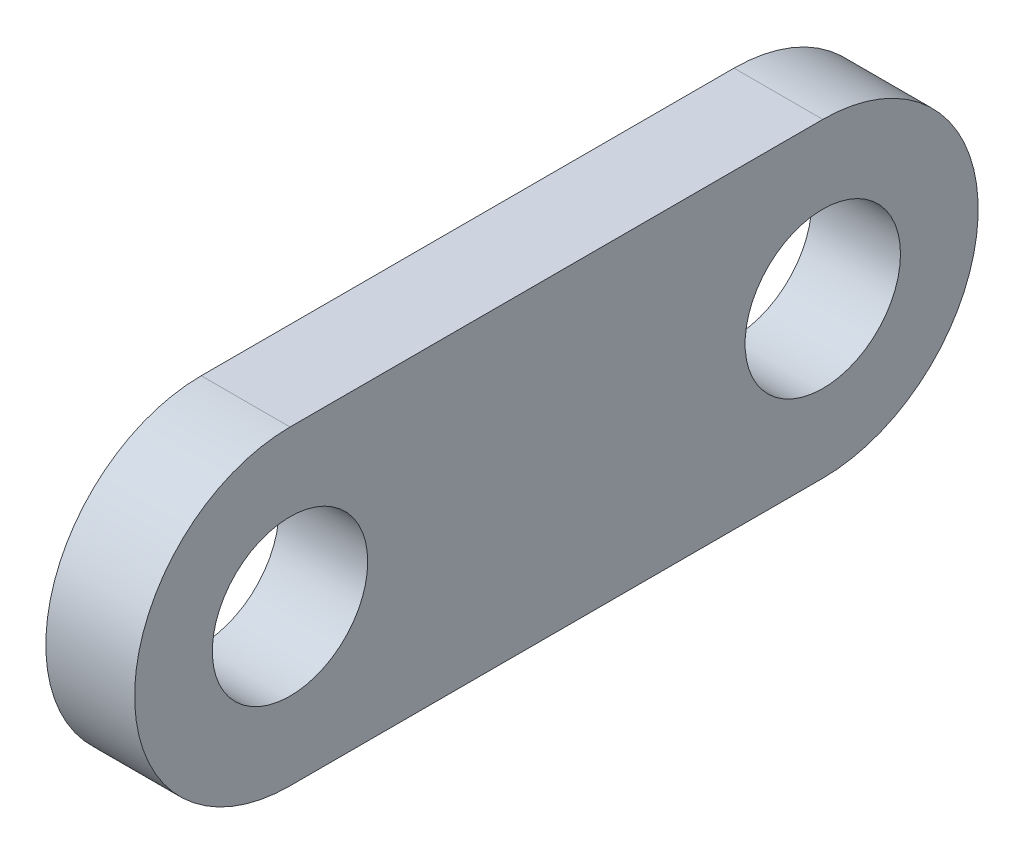
ISO-10303-21;
HEADER;
FILE_DESCRIPTION(('STEP AP214'),'2;1');
FILE_NAME('part.step','',(''),(''),'','','');
FILE_SCHEMA(('AUTOMOTIVE_DESIGN { 1 0 10303 214 1 1 1 1 }'));
ENDSEC;
DATA;
#1=APPLICATION_CONTEXT('core data for automotive mechanical design processes');
#2=APPLICATION_PROTOCOL_DEFINITION('international standard','automotive_design',2000,#1);
#3=PRODUCT_CONTEXT('',#1,'mechanical');
#4=PRODUCT('Part','Part','',(#3));
#5=PRODUCT_RELATED_PRODUCT_CATEGORY('part','',(#4));
#6=PRODUCT_DEFINITION_FORMATION('','',#4);
#7=PRODUCT_DEFINITION_CONTEXT('part definition',#1,'design');
#8=PRODUCT_DEFINITION('design','',#6,#7);
#9=PRODUCT_DEFINITION_SHAPE('','',#8);
#10=(LENGTH_UNIT() NAMED_UNIT(*) SI_UNIT(.MILLI.,.METRE.));
#11=(NAMED_UNIT(*) PLANE_ANGLE_UNIT() SI_UNIT($,.RADIAN.));
#12=(NAMED_UNIT(*) SI_UNIT($,.STERADIAN.) SOLID_ANGLE_UNIT());
#13=UNCERTAINTY_MEASURE_WITH_UNIT(LENGTH_MEASURE(1.E-05),#10,'distance_accuracy_value','');
#14=(GEOMETRIC_REPRESENTATION_CONTEXT(3) GLOBAL_UNCERTAINTY_ASSIGNED_CONTEXT((#13)) GLOBAL_UNIT_ASSIGNED_CONTEXT((#10,
#11,#12)) REPRESENTATION_CONTEXT('',''));
#15=CARTESIAN_POINT('',(0.,0.,0.));
#16=DIRECTION('',(0.,0.,1.));
#17=DIRECTION('',(1.,0.,0.));
#18=AXIS2_PLACEMENT_3D('',#15,#16,#17);
#19=CARTESIAN_POINT('',(2.,0.77334506111397,6.));
#20=DIRECTION('',(-1.,0.,0.));
#21=DIRECTION('',(0.,0.,1.));
#22=AXIS2_PLACEMENT_3D('',#19,#20,#21);
#23=PLANE('',#22);
#24=CARTESIAN_POINT('',(2.,0.77334506111397,6.));
#25=DIRECTION('',(1.,0.,0.));
#26=DIRECTION('',(0.,0.,-1.));
#27=AXIS2_PLACEMENT_3D('',#24,#25,#26);
#28=CIRCLE('',#27,1.75);
#29=CARTESIAN_POINT('',(2.,0.77334506111397,4.25));
#30=VERTEX_POINT('',#29);
#31=EDGE_CURVE('E102',#30,#30,#28,.T.);
#32=ORIENTED_EDGE('',*,*,#31,.F.);
#33=EDGE_LOOP('',(#32));
#34=FACE_BOUND('',#33,.T.);
#35=CARTESIAN_POINT('',(2.,0.77334506111397,6.));
#36=DIRECTION('',(1.,0.,0.));
#37=DIRECTION('',(0.,0.,1.));
#38=AXIS2_PLACEMENT_3D('',#35,#36,#37);
#39=CIRCLE('',#38,3.5);
#40=CARTESIAN_POINT('',(2.,4.27334506111397,6.));
#41=VERTEX_POINT('',#40);
#42=CARTESIAN_POINT('',(2.,-2.72665493888603,6.));
#43=VERTEX_POINT('',#42);
#44=EDGE_CURVE('E87',#41,#43,#39,.T.);
#45=ORIENTED_EDGE('',*,*,#44,.T.);
#46=DIRECTION('',(0.,0.,-1.));
#47=VECTOR('',#46,1.);
#48=CARTESIAN_POINT('',(2.,-2.72665493888603,6.));
#49=LINE('',#48,#47);
#50=CARTESIAN_POINT('',(2.,-2.72665493888603,-6.));
#51=VERTEX_POINT('',#50);
#52=EDGE_CURVE('E82',#43,#51,#49,.T.);
#53=ORIENTED_EDGE('',*,*,#52,.T.);
#54=CARTESIAN_POINT('',(2.,0.77334506111397,-6.));
#55=DIRECTION('',(1.,0.,0.));
#56=DIRECTION('',(0.,0.,1.));
#57=AXIS2_PLACEMENT_3D('',#54,#55,#56);
#58=CIRCLE('',#57,3.5);
#59=CARTESIAN_POINT('',(2.,4.27334506111397,-6.));
#60=VERTEX_POINT('',#59);
#61=EDGE_CURVE('E85',#51,#60,#58,.T.);
#62=ORIENTED_EDGE('',*,*,#61,.T.);
#63=DIRECTION('',(0.,0.,1.));
#64=VECTOR('',#63,1.);
#65=CARTESIAN_POINT('',(2.,4.27334506111397,6.));
#66=LINE('',#65,#64);
#67=EDGE_CURVE('E52',#60,#41,#66,.T.);
#68=ORIENTED_EDGE('',*,*,#67,.T.);
#69=EDGE_LOOP('',(#45,#53,#62,#68));
#70=FACE_BOUND('',#69,.T.);
#71=CARTESIAN_POINT('',(2.,0.77334506111397,-6.));
#72=DIRECTION('',(1.,0.,0.));
#73=DIRECTION('',(0.,0.,-1.));
#74=AXIS2_PLACEMENT_3D('',#71,#72,#73);
#75=CIRCLE('',#74,1.75);
#76=CARTESIAN_POINT('',(2.,0.77334506111397,-7.75));
#77=VERTEX_POINT('',#76);
#78=EDGE_CURVE('E117',#77,#77,#75,.T.);
#79=ORIENTED_EDGE('',*,*,#78,.F.);
#80=EDGE_LOOP('',(#79));
#81=FACE_BOUND('',#80,.T.);
#82=ADVANCED_FACE('F35',(#34,#70,#81),#23,.F.);
#83=CARTESIAN_POINT('',(0.,0.77334506111397,6.));
#84=DIRECTION('',(-1.,0.,0.));
#85=DIRECTION('',(0.,0.,1.));
#86=AXIS2_PLACEMENT_3D('',#83,#84,#85);
#87=PLANE('',#86);
#88=CARTESIAN_POINT('',(0.,0.77334506111397,6.));
#89=DIRECTION('',(1.,0.,0.));
#90=DIRECTION('',(0.,0.,-1.));
#91=AXIS2_PLACEMENT_3D('',#88,#89,#90);
#92=CIRCLE('',#91,1.75);
#93=CARTESIAN_POINT('',(0.,0.77334506111397,4.25));
#94=VERTEX_POINT('',#93);
#95=EDGE_CURVE('E114',#94,#94,#92,.T.);
#96=ORIENTED_EDGE('',*,*,#95,.T.);
#97=EDGE_LOOP('',(#96));
#98=FACE_BOUND('',#97,.T.);
#99=CARTESIAN_POINT('',(0.,0.77334506111397,6.));
#100=DIRECTION('',(1.,0.,0.));
#101=DIRECTION('',(0.,0.,1.));
#102=AXIS2_PLACEMENT_3D('',#99,#100,#101);
#103=CIRCLE('',#102,3.5);
#104=CARTESIAN_POINT('',(0.,4.27334506111397,6.));
#105=VERTEX_POINT('',#104);
#106=CARTESIAN_POINT('',(0.,-2.72665493888603,6.));
#107=VERTEX_POINT('',#106);
#108=EDGE_CURVE('E99',#105,#107,#103,.T.);
#109=ORIENTED_EDGE('',*,*,#108,.F.);
#110=DIRECTION('',(0.,0.,1.));
#111=VECTOR('',#110,1.);
#112=CARTESIAN_POINT('',(0.,4.27334506111397,6.));
#113=LINE('',#112,#111);
#114=CARTESIAN_POINT('',(0.,4.27334506111397,-6.));
#115=VERTEX_POINT('',#114);
#116=EDGE_CURVE('E75',#115,#105,#113,.T.);
#117=ORIENTED_EDGE('',*,*,#116,.F.);
#118=CARTESIAN_POINT('',(0.,0.77334506111397,-6.));
#119=DIRECTION('',(1.,0.,0.));
#120=DIRECTION('',(0.,0.,1.));
#121=AXIS2_PLACEMENT_3D('',#118,#119,#120);
#122=CIRCLE('',#121,3.5);
#123=CARTESIAN_POINT('',(0.,-2.72665493888603,-6.));
#124=VERTEX_POINT('',#123);
#125=EDGE_CURVE('E69',#124,#115,#122,.T.);
#126=ORIENTED_EDGE('',*,*,#125,.F.);
#127=DIRECTION('',(0.,0.,-1.));
#128=VECTOR('',#127,1.);
#129=CARTESIAN_POINT('',(0.,-2.72665493888603,6.));
#130=LINE('',#129,#128);
#131=EDGE_CURVE('E91',#107,#124,#130,.T.);
#132=ORIENTED_EDGE('',*,*,#131,.F.);
#133=EDGE_LOOP('',(#109,#117,#126,#132));
#134=FACE_BOUND('',#133,.T.);
#135=CARTESIAN_POINT('',(0.,0.77334506111397,-6.));
#136=DIRECTION('',(1.,0.,0.));
#137=DIRECTION('',(0.,0.,-1.));
#138=AXIS2_PLACEMENT_3D('',#135,#136,#137);
#139=CIRCLE('',#138,1.75);
#140=CARTESIAN_POINT('',(0.,0.77334506111397,-7.75));
#141=VERTEX_POINT('',#140);
#142=EDGE_CURVE('E120',#141,#141,#139,.T.);
#143=ORIENTED_EDGE('',*,*,#142,.T.);
#144=EDGE_LOOP('',(#143));
#145=FACE_BOUND('',#144,.T.);
#146=ADVANCED_FACE('F110',(#98,#134,#145),#87,.T.);
#147=CARTESIAN_POINT('',(2.,0.77334506111397,6.));
#148=DIRECTION('',(-1.,0.,0.));
#149=DIRECTION('',(0.,0.,1.));
#150=AXIS2_PLACEMENT_3D('',#147,#148,#149);
#151=CYLINDRICAL_SURFACE('',#150,3.5);
#152=ORIENTED_EDGE('',*,*,#108,.T.);
#153=DIRECTION('',(-1.,0.,0.));
#154=VECTOR('',#153,1.);
#155=CARTESIAN_POINT('',(2.,-2.72665493888603,6.));
#156=LINE('',#155,#154);
#157=EDGE_CURVE('E11',#43,#107,#156,.T.);
#158=ORIENTED_EDGE('',*,*,#157,.F.);
#159=ORIENTED_EDGE('',*,*,#44,.F.);
#160=DIRECTION('',(-1.,0.,0.));
#161=VECTOR('',#160,1.);
#162=CARTESIAN_POINT('',(2.,4.27334506111397,6.));
#163=LINE('',#162,#161);
#164=EDGE_CURVE('E95',#41,#105,#163,.T.);
#165=ORIENTED_EDGE('',*,*,#164,.T.);
#166=EDGE_LOOP('',(#152,#158,#159,#165));
#167=FACE_BOUND('',#166,.T.);
#168=ADVANCED_FACE('F37',(#167),#151,.T.);
#169=CARTESIAN_POINT('',(2.,-2.72665493888603,6.));
#170=DIRECTION('',(0.,1.,0.));
#171=DIRECTION('',(0.,0.,1.));
#172=AXIS2_PLACEMENT_3D('',#169,#170,#171);
#173=PLANE('',#172);
#174=ORIENTED_EDGE('',*,*,#131,.T.);
#175=DIRECTION('',(-1.,0.,0.));
#176=VECTOR('',#175,1.);
#177=CARTESIAN_POINT('',(2.,-2.72665493888603,-6.));
#178=LINE('',#177,#176);
#179=EDGE_CURVE('E44',#51,#124,#178,.T.);
#180=ORIENTED_EDGE('',*,*,#179,.F.);
#181=ORIENTED_EDGE('',*,*,#52,.F.);
#182=ORIENTED_EDGE('',*,*,#157,.T.);
#183=EDGE_LOOP('',(#174,#180,#181,#182));
#184=FACE_BOUND('',#183,.T.);
#185=ADVANCED_FACE('F90',(#184),#173,.F.);
#186=CARTESIAN_POINT('',(2.,0.77334506111397,-6.));
#187=DIRECTION('',(-1.,0.,0.));
#188=DIRECTION('',(0.,0.,1.));
#189=AXIS2_PLACEMENT_3D('',#186,#187,#188);
#190=CYLINDRICAL_SURFACE('',#189,3.5);
#191=ORIENTED_EDGE('',*,*,#125,.T.);
#192=DIRECTION('',(-1.,0.,0.));
#193=VECTOR('',#192,1.);
#194=CARTESIAN_POINT('',(2.,4.27334506111397,-6.));
#195=LINE('',#194,#193);
#196=EDGE_CURVE('E92',#60,#115,#195,.T.);
#197=ORIENTED_EDGE('',*,*,#196,.F.);
#198=ORIENTED_EDGE('',*,*,#61,.F.);
#199=ORIENTED_EDGE('',*,*,#179,.T.);
#200=EDGE_LOOP('',(#191,#197,#198,#199));
#201=FACE_BOUND('',#200,.T.);
#202=ADVANCED_FACE('F93',(#201),#190,.T.);
#203=CARTESIAN_POINT('',(2.,4.27334506111397,6.));
#204=DIRECTION('',(0.,-1.,0.));
#205=DIRECTION('',(0.,0.,-1.));
#206=AXIS2_PLACEMENT_3D('',#203,#204,#205);
#207=PLANE('',#206);
#208=ORIENTED_EDGE('',*,*,#116,.T.);
#209=ORIENTED_EDGE('',*,*,#164,.F.);
#210=ORIENTED_EDGE('',*,*,#67,.F.);
#211=ORIENTED_EDGE('',*,*,#196,.T.);
#212=EDGE_LOOP('',(#208,#209,#210,#211));
#213=FACE_BOUND('',#212,.T.);
#214=ADVANCED_FACE('F107',(#213),#207,.F.);
#215=CARTESIAN_POINT('',(2.,0.77334506111397,6.));
#216=DIRECTION('',(-1.,0.,0.));
#217=DIRECTION('',(0.,0.,1.));
#218=AXIS2_PLACEMENT_3D('',#215,#216,#217);
#219=CYLINDRICAL_SURFACE('',#218,1.75);
#220=ORIENTED_EDGE('',*,*,#31,.T.);
#221=EDGE_LOOP('',(#220));
#222=FACE_BOUND('',#221,.T.);
#223=ORIENTED_EDGE('',*,*,#95,.F.);
#224=EDGE_LOOP('',(#223));
#225=FACE_BOUND('',#224,.T.);
#226=ADVANCED_FACE('F138',(#222,#225),#219,.F.);
#227=CARTESIAN_POINT('',(2.,0.77334506111397,-6.));
#228=DIRECTION('',(-1.,0.,0.));
#229=DIRECTION('',(0.,0.,1.));
#230=AXIS2_PLACEMENT_3D('',#227,#228,#229);
#231=CYLINDRICAL_SURFACE('',#230,1.75);
#232=ORIENTED_EDGE('',*,*,#78,.T.);
#233=EDGE_LOOP('',(#232));
#234=FACE_BOUND('',#233,.T.);
#235=ORIENTED_EDGE('',*,*,#142,.F.);
#236=EDGE_LOOP('',(#235));
#237=FACE_BOUND('',#236,.T.);
#238=ADVANCED_FACE('F126',(#234,#237),#231,.F.);
#239=CLOSED_SHELL('',(#82,#146,#168,#185,#202,#214,#226,#238));
#240=MANIFOLD_SOLID_BREP('B2',#239);
#241=ADVANCED_BREP_SHAPE_REPRESENTATION('',(#18,#240),#14);
#242=SHAPE_DEFINITION_REPRESENTATION(#9,#241);
ENDSEC;
END-ISO-10303-21;
